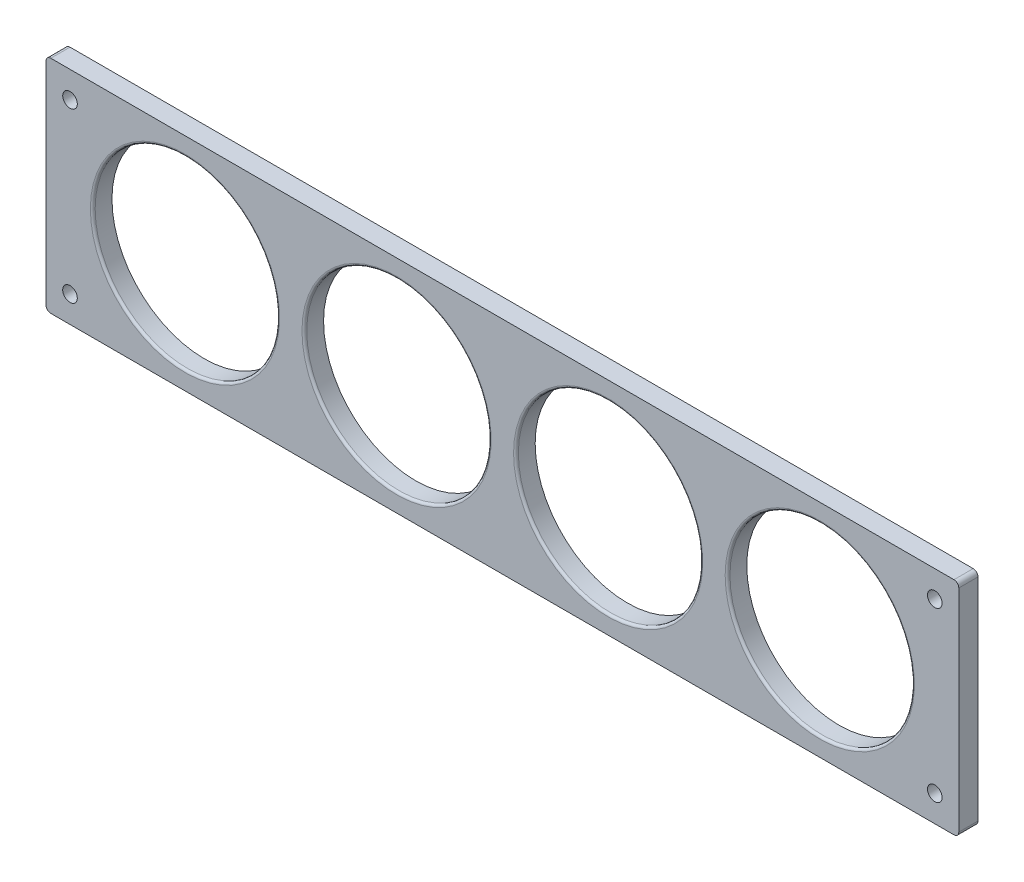
ISO-10303-21;
HEADER;
FILE_DESCRIPTION(('STEP AP214'),'2;1');
FILE_NAME('part.step','',(''),(''),'','','');
FILE_SCHEMA(('AUTOMOTIVE_DESIGN { 1 0 10303 214 1 1 1 1 }'));
ENDSEC;
DATA;
#1=APPLICATION_CONTEXT('core data for automotive mechanical design processes');
#2=APPLICATION_PROTOCOL_DEFINITION('international standard','automotive_design',2000,#1);
#3=PRODUCT_CONTEXT('',#1,'mechanical');
#4=PRODUCT('Part','Part','',(#3));
#5=PRODUCT_RELATED_PRODUCT_CATEGORY('part','',(#4));
#6=PRODUCT_DEFINITION_FORMATION('','',#4);
#7=PRODUCT_DEFINITION_CONTEXT('part definition',#1,'design');
#8=PRODUCT_DEFINITION('design','',#6,#7);
#9=PRODUCT_DEFINITION_SHAPE('','',#8);
#10=(LENGTH_UNIT() NAMED_UNIT(*) SI_UNIT(.MILLI.,.METRE.));
#11=(NAMED_UNIT(*) PLANE_ANGLE_UNIT() SI_UNIT($,.RADIAN.));
#12=(NAMED_UNIT(*) SI_UNIT($,.STERADIAN.) SOLID_ANGLE_UNIT());
#13=UNCERTAINTY_MEASURE_WITH_UNIT(LENGTH_MEASURE(1.E-05),#10,'distance_accuracy_value','');
#14=(GEOMETRIC_REPRESENTATION_CONTEXT(3) GLOBAL_UNCERTAINTY_ASSIGNED_CONTEXT((#13)) GLOBAL_UNIT_ASSIGNED_CONTEXT((#10,
#11,#12)) REPRESENTATION_CONTEXT('',''));
#15=CARTESIAN_POINT('',(0.,0.,0.));
#16=DIRECTION('',(0.,0.,1.));
#17=DIRECTION('',(1.,0.,0.));
#18=AXIS2_PLACEMENT_3D('',#15,#16,#17);
#19=CARTESIAN_POINT('',(0.,0.,4.));
#20=DIRECTION('',(0.,0.,-1.));
#21=DIRECTION('',(-1.,0.,0.));
#22=AXIS2_PLACEMENT_3D('',#19,#20,#21);
#23=PLANE('',#22);
#24=CARTESIAN_POINT('',(132.137772312129,0.,4.));
#25=DIRECTION('',(0.,0.,-1.));
#26=DIRECTION('',(-1.,0.,0.));
#27=AXIS2_PLACEMENT_3D('',#24,#25,#26);
#28=CIRCLE('',#27,19.7);
#29=CARTESIAN_POINT('',(112.437772312129,0.,4.));
#30=VERTEX_POINT('',#29);
#31=EDGE_CURVE('E193',#30,#30,#28,.T.);
#32=ORIENTED_EDGE('',*,*,#31,.T.);
#33=EDGE_LOOP('',(#32));
#34=FACE_BOUND('',#33,.T.);
#35=CARTESIAN_POINT('',(88.0918482080859,0.,4.));
#36=DIRECTION('',(0.,0.,-1.));
#37=DIRECTION('',(-1.,0.,0.));
#38=AXIS2_PLACEMENT_3D('',#35,#36,#37);
#39=CIRCLE('',#38,19.7);
#40=CARTESIAN_POINT('',(68.3918482080859,0.,4.));
#41=VERTEX_POINT('',#40);
#42=EDGE_CURVE('E190',#41,#41,#39,.T.);
#43=ORIENTED_EDGE('',*,*,#42,.T.);
#44=EDGE_LOOP('',(#43));
#45=FACE_BOUND('',#44,.T.);
#46=CARTESIAN_POINT('',(44.045924104043,0.,4.));
#47=DIRECTION('',(0.,0.,-1.));
#48=DIRECTION('',(-1.,0.,0.));
#49=AXIS2_PLACEMENT_3D('',#46,#47,#48);
#50=CIRCLE('',#49,19.7);
#51=CARTESIAN_POINT('',(24.345924104043,0.,4.));
#52=VERTEX_POINT('',#51);
#53=EDGE_CURVE('E187',#52,#52,#50,.T.);
#54=ORIENTED_EDGE('',*,*,#53,.T.);
#55=EDGE_LOOP('',(#54));
#56=FACE_BOUND('',#55,.T.);
#57=CARTESIAN_POINT('',(0.,0.,4.));
#58=DIRECTION('',(0.,0.,-1.));
#59=DIRECTION('',(-1.,0.,0.));
#60=AXIS2_PLACEMENT_3D('',#57,#58,#59);
#61=CIRCLE('',#60,19.7);
#62=CARTESIAN_POINT('',(-19.7,0.,4.));
#63=VERTEX_POINT('',#62);
#64=EDGE_CURVE('E184',#63,#63,#61,.T.);
#65=ORIENTED_EDGE('',*,*,#64,.T.);
#66=EDGE_LOOP('',(#65));
#67=FACE_BOUND('',#66,.T.);
#68=CARTESIAN_POINT('',(156.073056195928,17.4993695057085,4.));
#69=DIRECTION('',(0.,0.,1.));
#70=DIRECTION('',(-1.,0.,0.));
#71=AXIS2_PLACEMENT_3D('',#68,#69,#70);
#72=CIRCLE('',#71,1.52000000000002);
#73=CARTESIAN_POINT('',(154.553056195928,17.4993695057085,4.));
#74=VERTEX_POINT('',#73);
#75=EDGE_CURVE('E333',#74,#74,#72,.T.);
#76=ORIENTED_EDGE('',*,*,#75,.F.);
#77=EDGE_LOOP('',(#76));
#78=FACE_BOUND('',#77,.T.);
#79=CARTESIAN_POINT('',(156.073056195928,-17.4993695057084,4.));
#80=DIRECTION('',(0.,0.,1.));
#81=DIRECTION('',(1.,0.,0.));
#82=AXIS2_PLACEMENT_3D('',#79,#80,#81);
#83=CIRCLE('',#82,1.51999999999999);
#84=CARTESIAN_POINT('',(157.593056195928,-17.4993695057084,4.));
#85=VERTEX_POINT('',#84);
#86=EDGE_CURVE('E329',#85,#85,#83,.T.);
#87=ORIENTED_EDGE('',*,*,#86,.F.);
#88=EDGE_LOOP('',(#87));
#89=FACE_BOUND('',#88,.T.);
#90=CARTESIAN_POINT('',(-23.9352838837988,-17.4993695057085,4.));
#91=DIRECTION('',(0.,0.,1.));
#92=DIRECTION('',(-1.,0.,0.));
#93=AXIS2_PLACEMENT_3D('',#90,#91,#92);
#94=CIRCLE('',#93,1.52);
#95=CARTESIAN_POINT('',(-25.4552838837988,-17.4993695057085,4.));
#96=VERTEX_POINT('',#95);
#97=EDGE_CURVE('E327',#96,#96,#94,.T.);
#98=ORIENTED_EDGE('',*,*,#97,.F.);
#99=EDGE_LOOP('',(#98));
#100=FACE_BOUND('',#99,.T.);
#101=CARTESIAN_POINT('',(-23.9352838837988,17.4993695057085,4.));
#102=DIRECTION('',(0.,0.,1.));
#103=DIRECTION('',(1.,0.,0.));
#104=AXIS2_PLACEMENT_3D('',#101,#102,#103);
#105=CIRCLE('',#104,1.52);
#106=CARTESIAN_POINT('',(-22.4152838837988,17.4993695057085,4.));
#107=VERTEX_POINT('',#106);
#108=EDGE_CURVE('E147',#107,#107,#105,.T.);
#109=ORIENTED_EDGE('',*,*,#108,.F.);
#110=EDGE_LOOP('',(#109));
#111=FACE_BOUND('',#110,.T.);
#112=DIRECTION('',(1.,0.,0.));
#113=VECTOR('',#112,1.);
#114=CARTESIAN_POINT('',(-28.9311138439356,-23.,4.));
#115=LINE('',#114,#113);
#116=CARTESIAN_POINT('',(-27.9311138439356,-23.,4.));
#117=VERTEX_POINT('',#116);
#118=CARTESIAN_POINT('',(160.068886156064,-23.,4.));
#119=VERTEX_POINT('',#118);
#120=EDGE_CURVE('E137',#117,#119,#115,.T.);
#121=ORIENTED_EDGE('',*,*,#120,.T.);
#122=CARTESIAN_POINT('',(160.068886156064,-22.,4.));
#123=DIRECTION('',(0.,0.,-1.));
#124=DIRECTION('',(-1.,0.,0.));
#125=AXIS2_PLACEMENT_3D('',#122,#123,#124);
#126=CIRCLE('',#125,1.);
#127=CARTESIAN_POINT('',(161.068886156064,-22.,4.));
#128=VERTEX_POINT('',#127);
#129=EDGE_CURVE('E170',#119,#128,#126,.F.);
#130=ORIENTED_EDGE('',*,*,#129,.T.);
#131=DIRECTION('',(0.,1.,0.));
#132=VECTOR('',#131,1.);
#133=CARTESIAN_POINT('',(161.068886156064,-23.,4.));
#134=LINE('',#133,#132);
#135=CARTESIAN_POINT('',(161.068886156064,22.,4.));
#136=VERTEX_POINT('',#135);
#137=EDGE_CURVE('E120',#128,#136,#134,.T.);
#138=ORIENTED_EDGE('',*,*,#137,.T.);
#139=CARTESIAN_POINT('',(160.068886156064,22.,4.));
#140=DIRECTION('',(0.,0.,-1.));
#141=DIRECTION('',(-1.,0.,0.));
#142=AXIS2_PLACEMENT_3D('',#139,#140,#141);
#143=CIRCLE('',#142,1.);
#144=CARTESIAN_POINT('',(160.068886156064,23.,4.));
#145=VERTEX_POINT('',#144);
#146=EDGE_CURVE('E168',#136,#145,#143,.F.);
#147=ORIENTED_EDGE('',*,*,#146,.T.);
#148=DIRECTION('',(-1.,0.,0.));
#149=VECTOR('',#148,1.);
#150=CARTESIAN_POINT('',(-28.9311138439356,23.,4.));
#151=LINE('',#150,#149);
#152=CARTESIAN_POINT('',(-27.9311138439356,23.,4.));
#153=VERTEX_POINT('',#152);
#154=EDGE_CURVE('E287',#145,#153,#151,.T.);
#155=ORIENTED_EDGE('',*,*,#154,.T.);
#156=CARTESIAN_POINT('',(-27.9311138439356,22.,4.));
#157=DIRECTION('',(0.,0.,-1.));
#158=DIRECTION('',(-1.,0.,0.));
#159=AXIS2_PLACEMENT_3D('',#156,#157,#158);
#160=CIRCLE('',#159,1.);
#161=CARTESIAN_POINT('',(-28.9311138439356,22.,4.));
#162=VERTEX_POINT('',#161);
#163=EDGE_CURVE('E55',#153,#162,#160,.F.);
#164=ORIENTED_EDGE('',*,*,#163,.T.);
#165=DIRECTION('',(0.,-1.,0.));
#166=VECTOR('',#165,1.);
#167=CARTESIAN_POINT('',(-28.9311138439356,-23.,4.));
#168=LINE('',#167,#166);
#169=CARTESIAN_POINT('',(-28.9311138439356,-22.,4.));
#170=VERTEX_POINT('',#169);
#171=EDGE_CURVE('E288',#162,#170,#168,.T.);
#172=ORIENTED_EDGE('',*,*,#171,.T.);
#173=CARTESIAN_POINT('',(-27.9311138439356,-22.,4.));
#174=DIRECTION('',(0.,0.,-1.));
#175=DIRECTION('',(-1.,0.,0.));
#176=AXIS2_PLACEMENT_3D('',#173,#174,#175);
#177=CIRCLE('',#176,1.);
#178=EDGE_CURVE('E165',#170,#117,#177,.F.);
#179=ORIENTED_EDGE('',*,*,#178,.T.);
#180=EDGE_LOOP('',(#121,#130,#138,#147,#155,#164,#172,#179));
#181=FACE_BOUND('',#180,.T.);
#182=ADVANCED_FACE('F33',(#34,#45,#56,#67,#78,#89,#100,#111,#181),#23,.F.);
#183=CARTESIAN_POINT('',(0.,0.,0.));
#184=DIRECTION('',(0.,0.,-1.));
#185=DIRECTION('',(-1.,0.,0.));
#186=AXIS2_PLACEMENT_3D('',#183,#184,#185);
#187=PLANE('',#186);
#188=CARTESIAN_POINT('',(156.073056195928,17.4993695057085,0.));
#189=DIRECTION('',(0.,0.,-1.));
#190=DIRECTION('',(-1.,0.,0.));
#191=AXIS2_PLACEMENT_3D('',#188,#189,#190);
#192=CIRCLE('',#191,1.52000000000002);
#193=CARTESIAN_POINT('',(154.553056195928,17.4993695057085,0.));
#194=VERTEX_POINT('',#193);
#195=EDGE_CURVE('E153',#194,#194,#192,.T.);
#196=ORIENTED_EDGE('',*,*,#195,.F.);
#197=EDGE_LOOP('',(#196));
#198=FACE_BOUND('',#197,.T.);
#199=CARTESIAN_POINT('',(156.073056195928,-17.4993695057084,0.));
#200=DIRECTION('',(0.,0.,-1.));
#201=DIRECTION('',(-1.,0.,0.));
#202=AXIS2_PLACEMENT_3D('',#199,#200,#201);
#203=CIRCLE('',#202,1.51999999999999);
#204=CARTESIAN_POINT('',(154.553056195928,-17.4993695057084,0.));
#205=VERTEX_POINT('',#204);
#206=EDGE_CURVE('E150',#205,#205,#203,.T.);
#207=ORIENTED_EDGE('',*,*,#206,.F.);
#208=EDGE_LOOP('',(#207));
#209=FACE_BOUND('',#208,.T.);
#210=CARTESIAN_POINT('',(-23.9352838837988,-17.4993695057085,0.));
#211=DIRECTION('',(0.,0.,-1.));
#212=DIRECTION('',(-1.,0.,0.));
#213=AXIS2_PLACEMENT_3D('',#210,#211,#212);
#214=CIRCLE('',#213,1.52);
#215=CARTESIAN_POINT('',(-25.4552838837988,-17.4993695057085,0.));
#216=VERTEX_POINT('',#215);
#217=EDGE_CURVE('E146',#216,#216,#214,.T.);
#218=ORIENTED_EDGE('',*,*,#217,.F.);
#219=EDGE_LOOP('',(#218));
#220=FACE_BOUND('',#219,.T.);
#221=CARTESIAN_POINT('',(-23.9352838837988,17.4993695057085,0.));
#222=DIRECTION('',(0.,0.,-1.));
#223=DIRECTION('',(-1.,0.,0.));
#224=AXIS2_PLACEMENT_3D('',#221,#222,#223);
#225=CIRCLE('',#224,1.52);
#226=CARTESIAN_POINT('',(-25.4552838837988,17.4993695057085,0.));
#227=VERTEX_POINT('',#226);
#228=EDGE_CURVE('E143',#227,#227,#225,.T.);
#229=ORIENTED_EDGE('',*,*,#228,.F.);
#230=EDGE_LOOP('',(#229));
#231=FACE_BOUND('',#230,.T.);
#232=CARTESIAN_POINT('',(88.0918482080859,0.,0.));
#233=DIRECTION('',(0.,0.,1.));
#234=DIRECTION('',(1.,0.,0.));
#235=AXIS2_PLACEMENT_3D('',#232,#233,#234);
#236=CIRCLE('',#235,19.2);
#237=CARTESIAN_POINT('',(107.291848208086,0.,0.));
#238=VERTEX_POINT('',#237);
#239=EDGE_CURVE('E277',#238,#238,#236,.T.);
#240=ORIENTED_EDGE('',*,*,#239,.T.);
#241=EDGE_LOOP('',(#240));
#242=FACE_BOUND('',#241,.T.);
#243=CARTESIAN_POINT('',(0.,0.,0.));
#244=DIRECTION('',(0.,0.,1.));
#245=DIRECTION('',(1.,0.,0.));
#246=AXIS2_PLACEMENT_3D('',#243,#244,#245);
#247=CIRCLE('',#246,19.2);
#248=CARTESIAN_POINT('',(19.2,0.,0.));
#249=VERTEX_POINT('',#248);
#250=EDGE_CURVE('E128',#249,#249,#247,.T.);
#251=ORIENTED_EDGE('',*,*,#250,.T.);
#252=EDGE_LOOP('',(#251));
#253=FACE_BOUND('',#252,.T.);
#254=DIRECTION('',(0.,1.,0.));
#255=VECTOR('',#254,1.);
#256=CARTESIAN_POINT('',(161.068886156064,-23.,0.));
#257=LINE('',#256,#255);
#258=CARTESIAN_POINT('',(161.068886156064,-22.,0.));
#259=VERTEX_POINT('',#258);
#260=CARTESIAN_POINT('',(161.068886156064,22.,0.));
#261=VERTEX_POINT('',#260);
#262=EDGE_CURVE('E117',#259,#261,#257,.T.);
#263=ORIENTED_EDGE('',*,*,#262,.F.);
#264=CARTESIAN_POINT('',(160.068886156064,-22.,0.));
#265=DIRECTION('',(0.,0.,-1.));
#266=DIRECTION('',(-1.,0.,0.));
#267=AXIS2_PLACEMENT_3D('',#264,#265,#266);
#268=CIRCLE('',#267,1.);
#269=CARTESIAN_POINT('',(160.068886156064,-23.,0.));
#270=VERTEX_POINT('',#269);
#271=EDGE_CURVE('E100',#259,#270,#268,.T.);
#272=ORIENTED_EDGE('',*,*,#271,.T.);
#273=DIRECTION('',(1.,0.,0.));
#274=VECTOR('',#273,1.);
#275=CARTESIAN_POINT('',(-28.9311138439356,-23.,0.));
#276=LINE('',#275,#274);
#277=CARTESIAN_POINT('',(-27.9311138439356,-23.,0.));
#278=VERTEX_POINT('',#277);
#279=EDGE_CURVE('E141',#278,#270,#276,.T.);
#280=ORIENTED_EDGE('',*,*,#279,.F.);
#281=CARTESIAN_POINT('',(-27.9311138439356,-22.,0.));
#282=DIRECTION('',(0.,0.,-1.));
#283=DIRECTION('',(-1.,0.,0.));
#284=AXIS2_PLACEMENT_3D('',#281,#282,#283);
#285=CIRCLE('',#284,1.);
#286=CARTESIAN_POINT('',(-28.9311138439356,-22.,0.));
#287=VERTEX_POINT('',#286);
#288=EDGE_CURVE('E121',#278,#287,#285,.T.);
#289=ORIENTED_EDGE('',*,*,#288,.T.);
#290=DIRECTION('',(0.,-1.,0.));
#291=VECTOR('',#290,1.);
#292=CARTESIAN_POINT('',(-28.9311138439356,-23.,0.));
#293=LINE('',#292,#291);
#294=CARTESIAN_POINT('',(-28.9311138439356,22.,0.));
#295=VERTEX_POINT('',#294);
#296=EDGE_CURVE('E131',#295,#287,#293,.T.);
#297=ORIENTED_EDGE('',*,*,#296,.F.);
#298=CARTESIAN_POINT('',(-27.9311138439356,22.,0.));
#299=DIRECTION('',(0.,0.,-1.));
#300=DIRECTION('',(-1.,0.,0.));
#301=AXIS2_PLACEMENT_3D('',#298,#299,#300);
#302=CIRCLE('',#301,1.);
#303=CARTESIAN_POINT('',(-27.9311138439356,23.,0.));
#304=VERTEX_POINT('',#303);
#305=EDGE_CURVE('E159',#295,#304,#302,.T.);
#306=ORIENTED_EDGE('',*,*,#305,.T.);
#307=DIRECTION('',(-1.,0.,0.));
#308=VECTOR('',#307,1.);
#309=CARTESIAN_POINT('',(-28.9311138439356,23.,0.));
#310=LINE('',#309,#308);
#311=CARTESIAN_POINT('',(160.068886156064,23.,0.));
#312=VERTEX_POINT('',#311);
#313=EDGE_CURVE('E127',#312,#304,#310,.T.);
#314=ORIENTED_EDGE('',*,*,#313,.F.);
#315=CARTESIAN_POINT('',(160.068886156064,22.,0.));
#316=DIRECTION('',(0.,0.,-1.));
#317=DIRECTION('',(-1.,0.,0.));
#318=AXIS2_PLACEMENT_3D('',#315,#316,#317);
#319=CIRCLE('',#318,1.);
#320=EDGE_CURVE('E111',#312,#261,#319,.T.);
#321=ORIENTED_EDGE('',*,*,#320,.T.);
#322=EDGE_LOOP('',(#263,#272,#280,#289,#297,#306,#314,#321));
#323=FACE_BOUND('',#322,.T.);
#324=CARTESIAN_POINT('',(44.045924104043,0.,0.));
#325=DIRECTION('',(0.,0.,1.));
#326=DIRECTION('',(1.,0.,0.));
#327=AXIS2_PLACEMENT_3D('',#324,#325,#326);
#328=CIRCLE('',#327,19.2);
#329=CARTESIAN_POINT('',(63.2459241040429,0.,0.));
#330=VERTEX_POINT('',#329);
#331=EDGE_CURVE('E134',#330,#330,#328,.T.);
#332=ORIENTED_EDGE('',*,*,#331,.T.);
#333=EDGE_LOOP('',(#332));
#334=FACE_BOUND('',#333,.T.);
#335=CARTESIAN_POINT('',(132.137772312129,0.,0.));
#336=DIRECTION('',(0.,0.,1.));
#337=DIRECTION('',(1.,0.,0.));
#338=AXIS2_PLACEMENT_3D('',#335,#336,#337);
#339=CIRCLE('',#338,19.2);
#340=CARTESIAN_POINT('',(151.337772312129,0.,0.));
#341=VERTEX_POINT('',#340);
#342=EDGE_CURVE('E156',#341,#341,#339,.T.);
#343=ORIENTED_EDGE('',*,*,#342,.T.);
#344=EDGE_LOOP('',(#343));
#345=FACE_BOUND('',#344,.T.);
#346=ADVANCED_FACE('F124',(#198,#209,#220,#231,#242,#253,#323,#334,#345),#187,.T.);
#347=CARTESIAN_POINT('',(161.068886156064,-23.,4.));
#348=DIRECTION('',(-1.,0.,0.));
#349=DIRECTION('',(0.,0.,1.));
#350=AXIS2_PLACEMENT_3D('',#347,#348,#349);
#351=PLANE('',#350);
#352=ORIENTED_EDGE('',*,*,#137,.F.);
#353=DIRECTION('',(0.,0.,-1.));
#354=VECTOR('',#353,1.);
#355=CARTESIAN_POINT('',(161.068886156064,-22.,4.));
#356=LINE('',#355,#354);
#357=EDGE_CURVE('E104',#128,#259,#356,.T.);
#358=ORIENTED_EDGE('',*,*,#357,.T.);
#359=ORIENTED_EDGE('',*,*,#262,.T.);
#360=DIRECTION('',(0.,0.,-1.));
#361=VECTOR('',#360,1.);
#362=CARTESIAN_POINT('',(161.068886156064,22.,4.));
#363=LINE('',#362,#361);
#364=EDGE_CURVE('E122',#261,#136,#363,.F.);
#365=ORIENTED_EDGE('',*,*,#364,.T.);
#366=EDGE_LOOP('',(#352,#358,#359,#365));
#367=FACE_BOUND('',#366,.T.);
#368=ADVANCED_FACE('F116',(#367),#351,.F.);
#369=CARTESIAN_POINT('',(-28.9311138439356,23.,4.));
#370=DIRECTION('',(0.,-1.,0.));
#371=DIRECTION('',(0.,0.,-1.));
#372=AXIS2_PLACEMENT_3D('',#369,#370,#371);
#373=PLANE('',#372);
#374=ORIENTED_EDGE('',*,*,#154,.F.);
#375=DIRECTION('',(0.,0.,-1.));
#376=VECTOR('',#375,1.);
#377=CARTESIAN_POINT('',(160.068886156064,23.,4.));
#378=LINE('',#377,#376);
#379=EDGE_CURVE('E174',#145,#312,#378,.T.);
#380=ORIENTED_EDGE('',*,*,#379,.T.);
#381=ORIENTED_EDGE('',*,*,#313,.T.);
#382=DIRECTION('',(0.,0.,-1.));
#383=VECTOR('',#382,1.);
#384=CARTESIAN_POINT('',(-27.9311138439356,23.,4.));
#385=LINE('',#384,#383);
#386=EDGE_CURVE('E172',#304,#153,#385,.F.);
#387=ORIENTED_EDGE('',*,*,#386,.T.);
#388=EDGE_LOOP('',(#374,#380,#381,#387));
#389=FACE_BOUND('',#388,.T.);
#390=ADVANCED_FACE('F239',(#389),#373,.F.);
#391=CARTESIAN_POINT('',(-28.9311138439356,-23.,4.));
#392=DIRECTION('',(1.,0.,0.));
#393=DIRECTION('',(0.,0.,-1.));
#394=AXIS2_PLACEMENT_3D('',#391,#392,#393);
#395=PLANE('',#394);
#396=ORIENTED_EDGE('',*,*,#171,.F.);
#397=DIRECTION('',(0.,0.,-1.));
#398=VECTOR('',#397,1.);
#399=CARTESIAN_POINT('',(-28.9311138439356,22.,4.));
#400=LINE('',#399,#398);
#401=EDGE_CURVE('E178',#162,#295,#400,.T.);
#402=ORIENTED_EDGE('',*,*,#401,.T.);
#403=ORIENTED_EDGE('',*,*,#296,.T.);
#404=DIRECTION('',(0.,0.,-1.));
#405=VECTOR('',#404,1.);
#406=CARTESIAN_POINT('',(-28.9311138439356,-22.,4.));
#407=LINE('',#406,#405);
#408=EDGE_CURVE('E48',#287,#170,#407,.F.);
#409=ORIENTED_EDGE('',*,*,#408,.T.);
#410=EDGE_LOOP('',(#396,#402,#403,#409));
#411=FACE_BOUND('',#410,.T.);
#412=ADVANCED_FACE('F235',(#411),#395,.F.);
#413=CARTESIAN_POINT('',(-28.9311138439356,-23.,4.));
#414=DIRECTION('',(0.,1.,0.));
#415=DIRECTION('',(0.,0.,1.));
#416=AXIS2_PLACEMENT_3D('',#413,#414,#415);
#417=PLANE('',#416);
#418=ORIENTED_EDGE('',*,*,#279,.T.);
#419=DIRECTION('',(0.,0.,-1.));
#420=VECTOR('',#419,1.);
#421=CARTESIAN_POINT('',(160.068886156064,-23.,4.));
#422=LINE('',#421,#420);
#423=EDGE_CURVE('E105',#270,#119,#422,.F.);
#424=ORIENTED_EDGE('',*,*,#423,.T.);
#425=ORIENTED_EDGE('',*,*,#120,.F.);
#426=DIRECTION('',(0.,0.,-1.));
#427=VECTOR('',#426,1.);
#428=CARTESIAN_POINT('',(-27.9311138439356,-23.,4.));
#429=LINE('',#428,#427);
#430=EDGE_CURVE('E110',#117,#278,#429,.T.);
#431=ORIENTED_EDGE('',*,*,#430,.T.);
#432=EDGE_LOOP('',(#418,#424,#425,#431));
#433=FACE_BOUND('',#432,.T.);
#434=ADVANCED_FACE('F232',(#433),#417,.F.);
#435=CARTESIAN_POINT('',(0.,0.,4.));
#436=DIRECTION('',(0.,0.,-1.));
#437=DIRECTION('',(-1.,0.,0.));
#438=AXIS2_PLACEMENT_3D('',#435,#436,#437);
#439=CYLINDRICAL_SURFACE('',#438,19.2);
#440=CARTESIAN_POINT('',(0.,0.,3.5));
#441=DIRECTION('',(0.,0.,-1.));
#442=DIRECTION('',(-1.,0.,0.));
#443=AXIS2_PLACEMENT_3D('',#440,#441,#442);
#444=CIRCLE('',#443,19.2);
#445=CARTESIAN_POINT('',(-19.2,0.,3.5));
#446=VERTEX_POINT('',#445);
#447=EDGE_CURVE('E11',#446,#446,#444,.F.);
#448=ORIENTED_EDGE('',*,*,#447,.T.);
#449=EDGE_LOOP('',(#448));
#450=FACE_BOUND('',#449,.T.);
#451=ORIENTED_EDGE('',*,*,#250,.F.);
#452=EDGE_LOOP('',(#451));
#453=FACE_BOUND('',#452,.T.);
#454=ADVANCED_FACE('F229',(#450,#453),#439,.F.);
#455=CARTESIAN_POINT('',(44.045924104043,0.,4.));
#456=DIRECTION('',(0.,0.,-1.));
#457=DIRECTION('',(-1.,0.,0.));
#458=AXIS2_PLACEMENT_3D('',#455,#456,#457);
#459=CYLINDRICAL_SURFACE('',#458,19.2);
#460=CARTESIAN_POINT('',(44.045924104043,0.,3.5));
#461=DIRECTION('',(0.,0.,-1.));
#462=DIRECTION('',(-1.,0.,0.));
#463=AXIS2_PLACEMENT_3D('',#460,#461,#462);
#464=CIRCLE('',#463,19.2);
#465=CARTESIAN_POINT('',(24.845924104043,0.,3.5));
#466=VERTEX_POINT('',#465);
#467=EDGE_CURVE('E41',#466,#466,#464,.F.);
#468=ORIENTED_EDGE('',*,*,#467,.T.);
#469=EDGE_LOOP('',(#468));
#470=FACE_BOUND('',#469,.T.);
#471=ORIENTED_EDGE('',*,*,#331,.F.);
#472=EDGE_LOOP('',(#471));
#473=FACE_BOUND('',#472,.T.);
#474=ADVANCED_FACE('F201',(#470,#473),#459,.F.);
#475=CARTESIAN_POINT('',(88.0918482080859,0.,4.));
#476=DIRECTION('',(0.,0.,-1.));
#477=DIRECTION('',(-1.,0.,0.));
#478=AXIS2_PLACEMENT_3D('',#475,#476,#477);
#479=CYLINDRICAL_SURFACE('',#478,19.2);
#480=CARTESIAN_POINT('',(88.0918482080859,0.,3.5));
#481=DIRECTION('',(0.,0.,-1.));
#482=DIRECTION('',(-1.,0.,0.));
#483=AXIS2_PLACEMENT_3D('',#480,#481,#482);
#484=CIRCLE('',#483,19.2);
#485=CARTESIAN_POINT('',(68.8918482080859,0.,3.5));
#486=VERTEX_POINT('',#485);
#487=EDGE_CURVE('E196',#486,#486,#484,.F.);
#488=ORIENTED_EDGE('',*,*,#487,.T.);
#489=EDGE_LOOP('',(#488));
#490=FACE_BOUND('',#489,.T.);
#491=ORIENTED_EDGE('',*,*,#239,.F.);
#492=EDGE_LOOP('',(#491));
#493=FACE_BOUND('',#492,.T.);
#494=ADVANCED_FACE('F272',(#490,#493),#479,.F.);
#495=CARTESIAN_POINT('',(132.137772312129,0.,4.));
#496=DIRECTION('',(0.,0.,-1.));
#497=DIRECTION('',(-1.,0.,0.));
#498=AXIS2_PLACEMENT_3D('',#495,#496,#497);
#499=CYLINDRICAL_SURFACE('',#498,19.2);
#500=CARTESIAN_POINT('',(132.137772312129,0.,3.5));
#501=DIRECTION('',(0.,0.,-1.));
#502=DIRECTION('',(-1.,0.,0.));
#503=AXIS2_PLACEMENT_3D('',#500,#501,#502);
#504=CIRCLE('',#503,19.2);
#505=CARTESIAN_POINT('',(112.937772312129,0.,3.5));
#506=VERTEX_POINT('',#505);
#507=EDGE_CURVE('E181',#506,#506,#504,.F.);
#508=ORIENTED_EDGE('',*,*,#507,.T.);
#509=EDGE_LOOP('',(#508));
#510=FACE_BOUND('',#509,.T.);
#511=ORIENTED_EDGE('',*,*,#342,.F.);
#512=EDGE_LOOP('',(#511));
#513=FACE_BOUND('',#512,.T.);
#514=ADVANCED_FACE('F268',(#510,#513),#499,.F.);
#515=CARTESIAN_POINT('',(-23.9352838837988,17.4993695057085,-1.));
#516=DIRECTION('',(0.,0.,1.));
#517=DIRECTION('',(1.,0.,0.));
#518=AXIS2_PLACEMENT_3D('',#515,#516,#517);
#519=CYLINDRICAL_SURFACE('',#518,1.52);
#520=ORIENTED_EDGE('',*,*,#228,.T.);
#521=EDGE_LOOP('',(#520));
#522=FACE_BOUND('',#521,.T.);
#523=ORIENTED_EDGE('',*,*,#108,.T.);
#524=EDGE_LOOP('',(#523));
#525=FACE_BOUND('',#524,.T.);
#526=ADVANCED_FACE('F271',(#522,#525),#519,.F.);
#527=CARTESIAN_POINT('',(-23.9352838837988,-17.4993695057085,-1.));
#528=DIRECTION('',(0.,0.,1.));
#529=DIRECTION('',(1.,0.,0.));
#530=AXIS2_PLACEMENT_3D('',#527,#528,#529);
#531=CYLINDRICAL_SURFACE('',#530,1.52);
#532=ORIENTED_EDGE('',*,*,#217,.T.);
#533=EDGE_LOOP('',(#532));
#534=FACE_BOUND('',#533,.T.);
#535=ORIENTED_EDGE('',*,*,#97,.T.);
#536=EDGE_LOOP('',(#535));
#537=FACE_BOUND('',#536,.T.);
#538=ADVANCED_FACE('F310',(#534,#537),#531,.F.);
#539=CARTESIAN_POINT('',(156.073056195928,-17.4993695057084,-1.));
#540=DIRECTION('',(0.,0.,1.));
#541=DIRECTION('',(1.,0.,0.));
#542=AXIS2_PLACEMENT_3D('',#539,#540,#541);
#543=CYLINDRICAL_SURFACE('',#542,1.51999999999999);
#544=ORIENTED_EDGE('',*,*,#206,.T.);
#545=EDGE_LOOP('',(#544));
#546=FACE_BOUND('',#545,.T.);
#547=ORIENTED_EDGE('',*,*,#86,.T.);
#548=EDGE_LOOP('',(#547));
#549=FACE_BOUND('',#548,.T.);
#550=ADVANCED_FACE('F314',(#546,#549),#543,.F.);
#551=CARTESIAN_POINT('',(156.073056195928,17.4993695057085,-1.));
#552=DIRECTION('',(0.,0.,1.));
#553=DIRECTION('',(1.,0.,0.));
#554=AXIS2_PLACEMENT_3D('',#551,#552,#553);
#555=CYLINDRICAL_SURFACE('',#554,1.52000000000002);
#556=ORIENTED_EDGE('',*,*,#195,.T.);
#557=EDGE_LOOP('',(#556));
#558=FACE_BOUND('',#557,.T.);
#559=ORIENTED_EDGE('',*,*,#75,.T.);
#560=EDGE_LOOP('',(#559));
#561=FACE_BOUND('',#560,.T.);
#562=ADVANCED_FACE('F248',(#558,#561),#555,.F.);
#563=CARTESIAN_POINT('',(160.068886156064,-22.,4.));
#564=DIRECTION('',(0.,0.,-1.));
#565=DIRECTION('',(-1.,0.,0.));
#566=AXIS2_PLACEMENT_3D('',#563,#564,#565);
#567=CYLINDRICAL_SURFACE('',#566,1.);
#568=ORIENTED_EDGE('',*,*,#129,.F.);
#569=ORIENTED_EDGE('',*,*,#423,.F.);
#570=ORIENTED_EDGE('',*,*,#271,.F.);
#571=ORIENTED_EDGE('',*,*,#357,.F.);
#572=EDGE_LOOP('',(#568,#569,#570,#571));
#573=FACE_BOUND('',#572,.T.);
#574=ADVANCED_FACE('F103',(#573),#567,.T.);
#575=CARTESIAN_POINT('',(160.068886156064,22.,4.));
#576=DIRECTION('',(0.,0.,-1.));
#577=DIRECTION('',(-1.,0.,0.));
#578=AXIS2_PLACEMENT_3D('',#575,#576,#577);
#579=CYLINDRICAL_SURFACE('',#578,1.);
#580=ORIENTED_EDGE('',*,*,#146,.F.);
#581=ORIENTED_EDGE('',*,*,#364,.F.);
#582=ORIENTED_EDGE('',*,*,#320,.F.);
#583=ORIENTED_EDGE('',*,*,#379,.F.);
#584=EDGE_LOOP('',(#580,#581,#582,#583));
#585=FACE_BOUND('',#584,.T.);
#586=ADVANCED_FACE('F247',(#585),#579,.T.);
#587=CARTESIAN_POINT('',(-27.9311138439356,22.,4.));
#588=DIRECTION('',(0.,0.,-1.));
#589=DIRECTION('',(-1.,0.,0.));
#590=AXIS2_PLACEMENT_3D('',#587,#588,#589);
#591=CYLINDRICAL_SURFACE('',#590,1.);
#592=ORIENTED_EDGE('',*,*,#163,.F.);
#593=ORIENTED_EDGE('',*,*,#386,.F.);
#594=ORIENTED_EDGE('',*,*,#305,.F.);
#595=ORIENTED_EDGE('',*,*,#401,.F.);
#596=EDGE_LOOP('',(#592,#593,#594,#595));
#597=FACE_BOUND('',#596,.T.);
#598=ADVANCED_FACE('F251',(#597),#591,.T.);
#599=CARTESIAN_POINT('',(-27.9311138439356,-22.,4.));
#600=DIRECTION('',(0.,0.,-1.));
#601=DIRECTION('',(-1.,0.,0.));
#602=AXIS2_PLACEMENT_3D('',#599,#600,#601);
#603=CYLINDRICAL_SURFACE('',#602,1.);
#604=ORIENTED_EDGE('',*,*,#178,.F.);
#605=ORIENTED_EDGE('',*,*,#408,.F.);
#606=ORIENTED_EDGE('',*,*,#288,.F.);
#607=ORIENTED_EDGE('',*,*,#430,.F.);
#608=EDGE_LOOP('',(#604,#605,#606,#607));
#609=FACE_BOUND('',#608,.T.);
#610=ADVANCED_FACE('F255',(#609),#603,.T.);
#611=CARTESIAN_POINT('',(132.137772312129,0.,3.5));
#612=DIRECTION('',(0.,0.,-1.));
#613=DIRECTION('',(-1.,0.,0.));
#614=AXIS2_PLACEMENT_3D('',#611,#612,#613);
#615=TOROIDAL_SURFACE('',#614,19.7,0.5);
#616=ORIENTED_EDGE('',*,*,#31,.F.);
#617=EDGE_LOOP('',(#616));
#618=FACE_BOUND('',#617,.T.);
#619=ORIENTED_EDGE('',*,*,#507,.F.);
#620=EDGE_LOOP('',(#619));
#621=FACE_BOUND('',#620,.T.);
#622=ADVANCED_FACE('F213',(#618,#621),#615,.T.);
#623=CARTESIAN_POINT('',(88.0918482080859,0.,3.5));
#624=DIRECTION('',(0.,0.,-1.));
#625=DIRECTION('',(-1.,0.,0.));
#626=AXIS2_PLACEMENT_3D('',#623,#624,#625);
#627=TOROIDAL_SURFACE('',#626,19.7,0.5);
#628=ORIENTED_EDGE('',*,*,#42,.F.);
#629=EDGE_LOOP('',(#628));
#630=FACE_BOUND('',#629,.T.);
#631=ORIENTED_EDGE('',*,*,#487,.F.);
#632=EDGE_LOOP('',(#631));
#633=FACE_BOUND('',#632,.T.);
#634=ADVANCED_FACE('F206',(#630,#633),#627,.T.);
#635=CARTESIAN_POINT('',(44.045924104043,0.,3.5));
#636=DIRECTION('',(0.,0.,-1.));
#637=DIRECTION('',(-1.,0.,0.));
#638=AXIS2_PLACEMENT_3D('',#635,#636,#637);
#639=TOROIDAL_SURFACE('',#638,19.7,0.5);
#640=ORIENTED_EDGE('',*,*,#53,.F.);
#641=EDGE_LOOP('',(#640));
#642=FACE_BOUND('',#641,.T.);
#643=ORIENTED_EDGE('',*,*,#467,.F.);
#644=EDGE_LOOP('',(#643));
#645=FACE_BOUND('',#644,.T.);
#646=ADVANCED_FACE('F204',(#642,#645),#639,.T.);
#647=CARTESIAN_POINT('',(0.,0.,3.5));
#648=DIRECTION('',(0.,0.,-1.));
#649=DIRECTION('',(-1.,0.,0.));
#650=AXIS2_PLACEMENT_3D('',#647,#648,#649);
#651=TOROIDAL_SURFACE('',#650,19.7,0.5);
#652=ORIENTED_EDGE('',*,*,#64,.F.);
#653=EDGE_LOOP('',(#652));
#654=FACE_BOUND('',#653,.T.);
#655=ORIENTED_EDGE('',*,*,#447,.F.);
#656=EDGE_LOOP('',(#655));
#657=FACE_BOUND('',#656,.T.);
#658=ADVANCED_FACE('F35',(#654,#657),#651,.T.);
#659=CLOSED_SHELL('',(#182,#346,#368,#390,#412,#434,#454,#474,#494,#514,#526,#538,#550,#562,
#574,#586,#598,#610,#622,#634,#646,#658));
#660=MANIFOLD_SOLID_BREP('B2',#659);
#661=ADVANCED_BREP_SHAPE_REPRESENTATION('',(#18,#660),#14);
#662=SHAPE_DEFINITION_REPRESENTATION(#9,#661);
ENDSEC;
END-ISO-10303-21;
